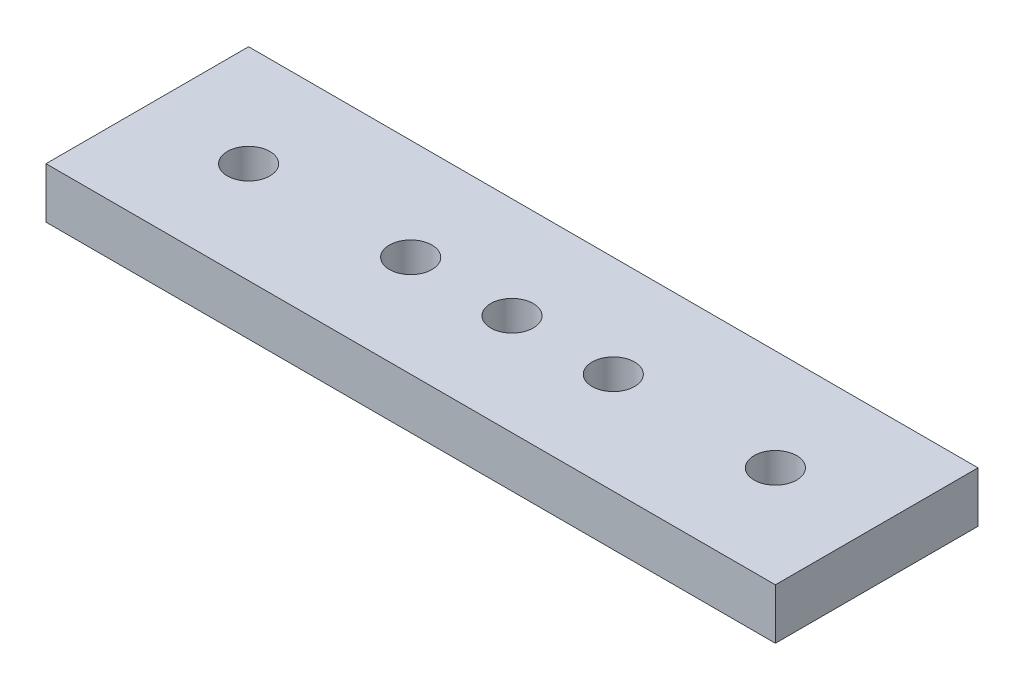
ISO-10303-21;
HEADER;
FILE_DESCRIPTION(('STEP AP214'),'2;1');
FILE_NAME('part.step','',(''),(''),'','','');
FILE_SCHEMA(('AUTOMOTIVE_DESIGN { 1 0 10303 214 1 1 1 1 }'));
ENDSEC;
DATA;
#1=APPLICATION_CONTEXT('core data for automotive mechanical design processes');
#2=APPLICATION_PROTOCOL_DEFINITION('international standard','automotive_design',2000,#1);
#3=PRODUCT_CONTEXT('',#1,'mechanical');
#4=PRODUCT('Part','Part','',(#3));
#5=PRODUCT_RELATED_PRODUCT_CATEGORY('part','',(#4));
#6=PRODUCT_DEFINITION_FORMATION('','',#4);
#7=PRODUCT_DEFINITION_CONTEXT('part definition',#1,'design');
#8=PRODUCT_DEFINITION('design','',#6,#7);
#9=PRODUCT_DEFINITION_SHAPE('','',#8);
#10=(LENGTH_UNIT() NAMED_UNIT(*) SI_UNIT(.MILLI.,.METRE.));
#11=(NAMED_UNIT(*) PLANE_ANGLE_UNIT() SI_UNIT($,.RADIAN.));
#12=(NAMED_UNIT(*) SI_UNIT($,.STERADIAN.) SOLID_ANGLE_UNIT());
#13=UNCERTAINTY_MEASURE_WITH_UNIT(LENGTH_MEASURE(1.E-05),#10,'distance_accuracy_value','');
#14=(GEOMETRIC_REPRESENTATION_CONTEXT(3) GLOBAL_UNCERTAINTY_ASSIGNED_CONTEXT((#13)) GLOBAL_UNIT_ASSIGNED_CONTEXT((#10,
#11,#12)) REPRESENTATION_CONTEXT('',''));
#15=CARTESIAN_POINT('',(0.,0.,0.));
#16=DIRECTION('',(0.,0.,1.));
#17=DIRECTION('',(1.,0.,0.));
#18=AXIS2_PLACEMENT_3D('',#15,#16,#17);
#19=CARTESIAN_POINT('',(-36.,0.,0.));
#20=DIRECTION('',(0.,0.,-1.));
#21=DIRECTION('',(-1.,0.,0.));
#22=AXIS2_PLACEMENT_3D('',#19,#20,#21);
#23=PLANE('',#22);
#24=DIRECTION('',(1.,0.,0.));
#25=VECTOR('',#24,1.);
#26=CARTESIAN_POINT('',(-36.,-5.00000000000002,0.));
#27=LINE('',#26,#25);
#28=CARTESIAN_POINT('',(-36.,-5.00000000000002,0.));
#29=VERTEX_POINT('',#28);
#30=CARTESIAN_POINT('',(36.,-5.00000000000002,0.));
#31=VERTEX_POINT('',#30);
#32=EDGE_CURVE('E97',#29,#31,#27,.T.);
#33=ORIENTED_EDGE('',*,*,#32,.F.);
#34=DIRECTION('',(0.,-1.,0.));
#35=VECTOR('',#34,1.);
#36=CARTESIAN_POINT('',(-36.,0.,0.));
#37=LINE('',#36,#35);
#38=CARTESIAN_POINT('',(-36.,0.,0.));
#39=VERTEX_POINT('',#38);
#40=EDGE_CURVE('E11',#39,#29,#37,.T.);
#41=ORIENTED_EDGE('',*,*,#40,.F.);
#42=DIRECTION('',(1.,0.,0.));
#43=VECTOR('',#42,1.);
#44=CARTESIAN_POINT('',(-36.,0.,0.));
#45=LINE('',#44,#43);
#46=CARTESIAN_POINT('',(36.,0.,0.));
#47=VERTEX_POINT('',#46);
#48=EDGE_CURVE('E90',#39,#47,#45,.T.);
#49=ORIENTED_EDGE('',*,*,#48,.T.);
#50=DIRECTION('',(0.,-1.,0.));
#51=VECTOR('',#50,1.);
#52=CARTESIAN_POINT('',(36.,0.,0.));
#53=LINE('',#52,#51);
#54=EDGE_CURVE('E35',#47,#31,#53,.T.);
#55=ORIENTED_EDGE('',*,*,#54,.T.);
#56=EDGE_LOOP('',(#33,#41,#49,#55));
#57=FACE_BOUND('',#56,.T.);
#58=ADVANCED_FACE('F32',(#57),#23,.T.);
#59=CARTESIAN_POINT('',(-36.,0.,20.));
#60=DIRECTION('',(-1.,0.,0.));
#61=DIRECTION('',(0.,0.,1.));
#62=AXIS2_PLACEMENT_3D('',#59,#60,#61);
#63=PLANE('',#62);
#64=DIRECTION('',(0.,0.,-1.));
#65=VECTOR('',#64,1.);
#66=CARTESIAN_POINT('',(-36.,-5.00000000000002,20.));
#67=LINE('',#66,#65);
#68=CARTESIAN_POINT('',(-36.,-5.00000000000002,20.));
#69=VERTEX_POINT('',#68);
#70=EDGE_CURVE('E92',#69,#29,#67,.T.);
#71=ORIENTED_EDGE('',*,*,#70,.F.);
#72=DIRECTION('',(0.,-1.,0.));
#73=VECTOR('',#72,1.);
#74=CARTESIAN_POINT('',(-36.,0.,20.));
#75=LINE('',#74,#73);
#76=CARTESIAN_POINT('',(-36.,0.,20.));
#77=VERTEX_POINT('',#76);
#78=EDGE_CURVE('E41',#77,#69,#75,.T.);
#79=ORIENTED_EDGE('',*,*,#78,.F.);
#80=DIRECTION('',(0.,0.,-1.));
#81=VECTOR('',#80,1.);
#82=CARTESIAN_POINT('',(-36.,0.,20.));
#83=LINE('',#82,#81);
#84=EDGE_CURVE('E87',#77,#39,#83,.T.);
#85=ORIENTED_EDGE('',*,*,#84,.T.);
#86=ORIENTED_EDGE('',*,*,#40,.T.);
#87=EDGE_LOOP('',(#71,#79,#85,#86));
#88=FACE_BOUND('',#87,.T.);
#89=ADVANCED_FACE('F108',(#88),#63,.T.);
#90=CARTESIAN_POINT('',(36.,0.,20.));
#91=DIRECTION('',(0.,0.,1.));
#92=DIRECTION('',(1.,0.,0.));
#93=AXIS2_PLACEMENT_3D('',#90,#91,#92);
#94=PLANE('',#93);
#95=DIRECTION('',(-1.,0.,0.));
#96=VECTOR('',#95,1.);
#97=CARTESIAN_POINT('',(36.,-5.00000000000002,20.));
#98=LINE('',#97,#96);
#99=CARTESIAN_POINT('',(36.,-5.00000000000002,20.));
#100=VERTEX_POINT('',#99);
#101=EDGE_CURVE('E82',#100,#69,#98,.T.);
#102=ORIENTED_EDGE('',*,*,#101,.F.);
#103=DIRECTION('',(0.,-1.,0.));
#104=VECTOR('',#103,1.);
#105=CARTESIAN_POINT('',(36.,0.,20.));
#106=LINE('',#105,#104);
#107=CARTESIAN_POINT('',(36.,0.,20.));
#108=VERTEX_POINT('',#107);
#109=EDGE_CURVE('E77',#108,#100,#106,.T.);
#110=ORIENTED_EDGE('',*,*,#109,.F.);
#111=DIRECTION('',(-1.,0.,0.));
#112=VECTOR('',#111,1.);
#113=CARTESIAN_POINT('',(36.,0.,20.));
#114=LINE('',#113,#112);
#115=EDGE_CURVE('E80',#108,#77,#114,.T.);
#116=ORIENTED_EDGE('',*,*,#115,.T.);
#117=ORIENTED_EDGE('',*,*,#78,.T.);
#118=EDGE_LOOP('',(#102,#110,#116,#117));
#119=FACE_BOUND('',#118,.T.);
#120=ADVANCED_FACE('F79',(#119),#94,.T.);
#121=CARTESIAN_POINT('',(36.,0.,0.));
#122=DIRECTION('',(1.,0.,0.));
#123=DIRECTION('',(0.,0.,-1.));
#124=AXIS2_PLACEMENT_3D('',#121,#122,#123);
#125=PLANE('',#124);
#126=DIRECTION('',(0.,0.,1.));
#127=VECTOR('',#126,1.);
#128=CARTESIAN_POINT('',(36.,-5.00000000000002,0.));
#129=LINE('',#128,#127);
#130=EDGE_CURVE('E100',#31,#100,#129,.T.);
#131=ORIENTED_EDGE('',*,*,#130,.F.);
#132=ORIENTED_EDGE('',*,*,#54,.F.);
#133=DIRECTION('',(0.,0.,1.));
#134=VECTOR('',#133,1.);
#135=CARTESIAN_POINT('',(36.,0.,0.));
#136=LINE('',#135,#134);
#137=EDGE_CURVE('E86',#47,#108,#136,.T.);
#138=ORIENTED_EDGE('',*,*,#137,.T.);
#139=ORIENTED_EDGE('',*,*,#109,.T.);
#140=EDGE_LOOP('',(#131,#132,#138,#139));
#141=FACE_BOUND('',#140,.T.);
#142=ADVANCED_FACE('F89',(#141),#125,.T.);
#143=CARTESIAN_POINT('',(0.,0.,0.));
#144=DIRECTION('',(0.,-1.,0.));
#145=DIRECTION('',(0.,0.,-1.));
#146=AXIS2_PLACEMENT_3D('',#143,#144,#145);
#147=PLANE('',#146);
#148=CARTESIAN_POINT('',(0.,0.,10.));
#149=DIRECTION('',(0.,-1.,0.));
#150=DIRECTION('',(0.,0.,1.));
#151=AXIS2_PLACEMENT_3D('',#148,#149,#150);
#152=CIRCLE('',#151,2.1);
#153=CARTESIAN_POINT('',(0.,0.,12.1));
#154=VERTEX_POINT('',#153);
#155=EDGE_CURVE('E153',#154,#154,#152,.T.);
#156=ORIENTED_EDGE('',*,*,#155,.T.);
#157=EDGE_LOOP('',(#156));
#158=FACE_BOUND('',#157,.T.);
#159=CARTESIAN_POINT('',(-26.,0.,9.99999999999999));
#160=DIRECTION('',(0.,-1.,0.));
#161=DIRECTION('',(0.,0.,1.));
#162=AXIS2_PLACEMENT_3D('',#159,#160,#161);
#163=CIRCLE('',#162,2.1);
#164=CARTESIAN_POINT('',(-26.,0.,12.1));
#165=VERTEX_POINT('',#164);
#166=EDGE_CURVE('E161',#165,#165,#163,.T.);
#167=ORIENTED_EDGE('',*,*,#166,.T.);
#168=EDGE_LOOP('',(#167));
#169=FACE_BOUND('',#168,.T.);
#170=CARTESIAN_POINT('',(-9.99999999999999,0.,10.));
#171=DIRECTION('',(0.,-1.,0.));
#172=DIRECTION('',(0.,0.,1.));
#173=AXIS2_PLACEMENT_3D('',#170,#171,#172);
#174=CIRCLE('',#173,2.1);
#175=CARTESIAN_POINT('',(-9.99999999999999,0.,12.1));
#176=VERTEX_POINT('',#175);
#177=EDGE_CURVE('E167',#176,#176,#174,.T.);
#178=ORIENTED_EDGE('',*,*,#177,.T.);
#179=EDGE_LOOP('',(#178));
#180=FACE_BOUND('',#179,.T.);
#181=CARTESIAN_POINT('',(26.,0.,10.));
#182=DIRECTION('',(0.,-1.,0.));
#183=DIRECTION('',(0.,0.,1.));
#184=AXIS2_PLACEMENT_3D('',#181,#182,#183);
#185=CIRCLE('',#184,2.1);
#186=CARTESIAN_POINT('',(26.,0.,12.1));
#187=VERTEX_POINT('',#186);
#188=EDGE_CURVE('E173',#187,#187,#185,.T.);
#189=ORIENTED_EDGE('',*,*,#188,.T.);
#190=EDGE_LOOP('',(#189));
#191=FACE_BOUND('',#190,.T.);
#192=CARTESIAN_POINT('',(10.,0.,10.));
#193=DIRECTION('',(0.,-1.,0.));
#194=DIRECTION('',(0.,0.,1.));
#195=AXIS2_PLACEMENT_3D('',#192,#193,#194);
#196=CIRCLE('',#195,2.1);
#197=CARTESIAN_POINT('',(10.,0.,12.1));
#198=VERTEX_POINT('',#197);
#199=EDGE_CURVE('E101',#198,#198,#196,.T.);
#200=ORIENTED_EDGE('',*,*,#199,.T.);
#201=EDGE_LOOP('',(#200));
#202=FACE_BOUND('',#201,.T.);
#203=ORIENTED_EDGE('',*,*,#48,.F.);
#204=ORIENTED_EDGE('',*,*,#84,.F.);
#205=ORIENTED_EDGE('',*,*,#115,.F.);
#206=ORIENTED_EDGE('',*,*,#137,.F.);
#207=EDGE_LOOP('',(#203,#204,#205,#206));
#208=FACE_BOUND('',#207,.T.);
#209=ADVANCED_FACE('F85',(#158,#169,#180,#191,#202,#208),#147,.F.);
#210=CARTESIAN_POINT('',(0.,-5.00000000000002,0.));
#211=DIRECTION('',(0.,-1.,0.));
#212=DIRECTION('',(0.,0.,-1.));
#213=AXIS2_PLACEMENT_3D('',#210,#211,#212);
#214=PLANE('',#213);
#215=CARTESIAN_POINT('',(0.,-5.00000000000002,10.));
#216=DIRECTION('',(0.,-1.,0.));
#217=DIRECTION('',(0.,0.,1.));
#218=AXIS2_PLACEMENT_3D('',#215,#216,#217);
#219=CIRCLE('',#218,2.1);
#220=CARTESIAN_POINT('',(0.,-5.00000000000002,12.1));
#221=VERTEX_POINT('',#220);
#222=EDGE_CURVE('E156',#221,#221,#219,.T.);
#223=ORIENTED_EDGE('',*,*,#222,.F.);
#224=EDGE_LOOP('',(#223));
#225=FACE_BOUND('',#224,.T.);
#226=CARTESIAN_POINT('',(-26.,-5.00000000000002,9.99999999999999));
#227=DIRECTION('',(0.,-1.,0.));
#228=DIRECTION('',(0.,0.,1.));
#229=AXIS2_PLACEMENT_3D('',#226,#227,#228);
#230=CIRCLE('',#229,2.1);
#231=CARTESIAN_POINT('',(-26.,-5.00000000000002,12.1));
#232=VERTEX_POINT('',#231);
#233=EDGE_CURVE('E158',#232,#232,#230,.T.);
#234=ORIENTED_EDGE('',*,*,#233,.F.);
#235=EDGE_LOOP('',(#234));
#236=FACE_BOUND('',#235,.T.);
#237=CARTESIAN_POINT('',(-9.99999999999999,-5.00000000000002,10.));
#238=DIRECTION('',(0.,-1.,0.));
#239=DIRECTION('',(0.,0.,1.));
#240=AXIS2_PLACEMENT_3D('',#237,#238,#239);
#241=CIRCLE('',#240,2.1);
#242=CARTESIAN_POINT('',(-9.99999999999999,-5.00000000000002,12.1));
#243=VERTEX_POINT('',#242);
#244=EDGE_CURVE('E164',#243,#243,#241,.T.);
#245=ORIENTED_EDGE('',*,*,#244,.F.);
#246=EDGE_LOOP('',(#245));
#247=FACE_BOUND('',#246,.T.);
#248=CARTESIAN_POINT('',(26.,-5.00000000000002,10.));
#249=DIRECTION('',(0.,-1.,0.));
#250=DIRECTION('',(0.,0.,1.));
#251=AXIS2_PLACEMENT_3D('',#248,#249,#250);
#252=CIRCLE('',#251,2.1);
#253=CARTESIAN_POINT('',(26.,-5.00000000000002,12.1));
#254=VERTEX_POINT('',#253);
#255=EDGE_CURVE('E170',#254,#254,#252,.T.);
#256=ORIENTED_EDGE('',*,*,#255,.F.);
#257=EDGE_LOOP('',(#256));
#258=FACE_BOUND('',#257,.T.);
#259=CARTESIAN_POINT('',(10.,-5.00000000000002,10.));
#260=DIRECTION('',(0.,-1.,0.));
#261=DIRECTION('',(0.,0.,1.));
#262=AXIS2_PLACEMENT_3D('',#259,#260,#261);
#263=CIRCLE('',#262,2.1);
#264=CARTESIAN_POINT('',(10.,-5.00000000000002,12.1));
#265=VERTEX_POINT('',#264);
#266=EDGE_CURVE('E176',#265,#265,#263,.T.);
#267=ORIENTED_EDGE('',*,*,#266,.F.);
#268=EDGE_LOOP('',(#267));
#269=FACE_BOUND('',#268,.T.);
#270=ORIENTED_EDGE('',*,*,#32,.T.);
#271=ORIENTED_EDGE('',*,*,#130,.T.);
#272=ORIENTED_EDGE('',*,*,#101,.T.);
#273=ORIENTED_EDGE('',*,*,#70,.T.);
#274=EDGE_LOOP('',(#270,#271,#272,#273));
#275=FACE_BOUND('',#274,.T.);
#276=ADVANCED_FACE('F107',(#225,#236,#247,#258,#269,#275),#214,.T.);
#277=CARTESIAN_POINT('',(10.,0.,10.));
#278=DIRECTION('',(0.,-1.,0.));
#279=DIRECTION('',(0.,0.,-1.));
#280=AXIS2_PLACEMENT_3D('',#277,#278,#279);
#281=CYLINDRICAL_SURFACE('',#280,2.1);
#282=ORIENTED_EDGE('',*,*,#199,.F.);
#283=EDGE_LOOP('',(#282));
#284=FACE_BOUND('',#283,.T.);
#285=ORIENTED_EDGE('',*,*,#266,.T.);
#286=EDGE_LOOP('',(#285));
#287=FACE_BOUND('',#286,.T.);
#288=ADVANCED_FACE('F126',(#284,#287),#281,.F.);
#289=CARTESIAN_POINT('',(26.,0.,10.));
#290=DIRECTION('',(0.,-1.,0.));
#291=DIRECTION('',(0.,0.,-1.));
#292=AXIS2_PLACEMENT_3D('',#289,#290,#291);
#293=CYLINDRICAL_SURFACE('',#292,2.1);
#294=ORIENTED_EDGE('',*,*,#188,.F.);
#295=EDGE_LOOP('',(#294));
#296=FACE_BOUND('',#295,.T.);
#297=ORIENTED_EDGE('',*,*,#255,.T.);
#298=EDGE_LOOP('',(#297));
#299=FACE_BOUND('',#298,.T.);
#300=ADVANCED_FACE('F133',(#296,#299),#293,.F.);
#301=CARTESIAN_POINT('',(-9.99999999999999,0.,10.));
#302=DIRECTION('',(0.,-1.,0.));
#303=DIRECTION('',(0.,0.,-1.));
#304=AXIS2_PLACEMENT_3D('',#301,#302,#303);
#305=CYLINDRICAL_SURFACE('',#304,2.1);
#306=ORIENTED_EDGE('',*,*,#177,.F.);
#307=EDGE_LOOP('',(#306));
#308=FACE_BOUND('',#307,.T.);
#309=ORIENTED_EDGE('',*,*,#244,.T.);
#310=EDGE_LOOP('',(#309));
#311=FACE_BOUND('',#310,.T.);
#312=ADVANCED_FACE('F137',(#308,#311),#305,.F.);
#313=CARTESIAN_POINT('',(-26.,0.,9.99999999999999));
#314=DIRECTION('',(0.,-1.,0.));
#315=DIRECTION('',(0.,0.,-1.));
#316=AXIS2_PLACEMENT_3D('',#313,#314,#315);
#317=CYLINDRICAL_SURFACE('',#316,2.1);
#318=ORIENTED_EDGE('',*,*,#166,.F.);
#319=EDGE_LOOP('',(#318));
#320=FACE_BOUND('',#319,.T.);
#321=ORIENTED_EDGE('',*,*,#233,.T.);
#322=EDGE_LOOP('',(#321));
#323=FACE_BOUND('',#322,.T.);
#324=ADVANCED_FACE('F141',(#320,#323),#317,.F.);
#325=CARTESIAN_POINT('',(0.,0.,10.));
#326=DIRECTION('',(0.,-1.,0.));
#327=DIRECTION('',(0.,0.,-1.));
#328=AXIS2_PLACEMENT_3D('',#325,#326,#327);
#329=CYLINDRICAL_SURFACE('',#328,2.1);
#330=ORIENTED_EDGE('',*,*,#155,.F.);
#331=EDGE_LOOP('',(#330));
#332=FACE_BOUND('',#331,.T.);
#333=ORIENTED_EDGE('',*,*,#222,.T.);
#334=EDGE_LOOP('',(#333));
#335=FACE_BOUND('',#334,.T.);
#336=ADVANCED_FACE('F145',(#332,#335),#329,.F.);
#337=CLOSED_SHELL('',(#58,#89,#120,#142,#209,#276,#288,#300,#312,#324,#336));
#338=MANIFOLD_SOLID_BREP('B2',#337);
#339=ADVANCED_BREP_SHAPE_REPRESENTATION('',(#18,#338),#14);
#340=SHAPE_DEFINITION_REPRESENTATION(#9,#339);
ENDSEC;
END-ISO-10303-21;
